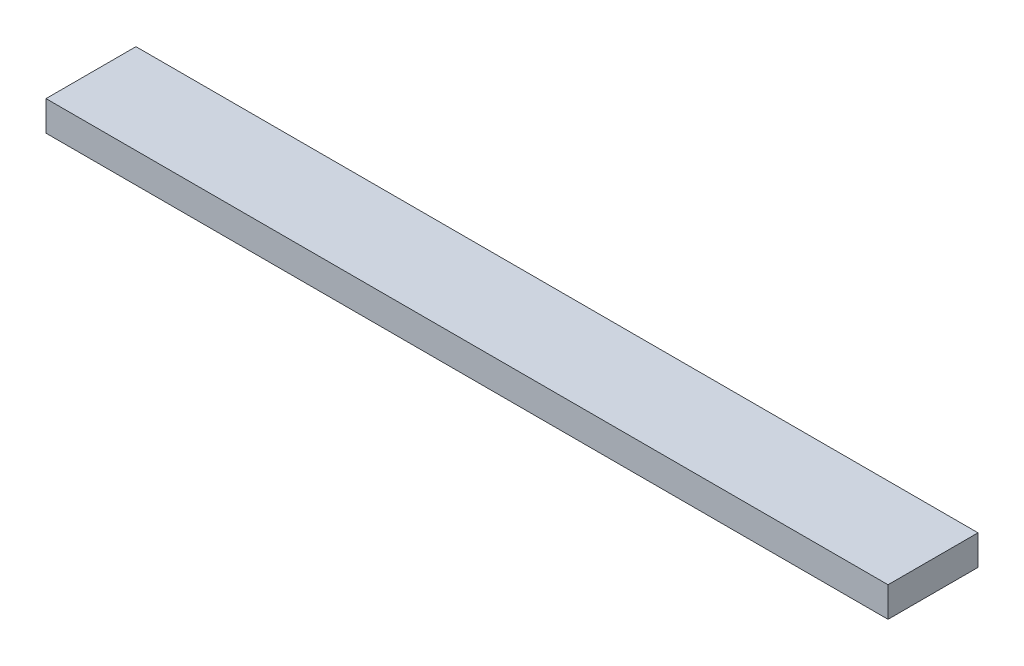
ISO-10303-21;
HEADER;
FILE_DESCRIPTION(('STEP AP214'),'2;1');
FILE_NAME('part.step','',(''),(''),'','','');
FILE_SCHEMA(('AUTOMOTIVE_DESIGN { 1 0 10303 214 1 1 1 1 }'));
ENDSEC;
DATA;
#1=APPLICATION_CONTEXT('core data for automotive mechanical design processes');
#2=APPLICATION_PROTOCOL_DEFINITION('international standard','automotive_design',2000,#1);
#3=PRODUCT_CONTEXT('',#1,'mechanical');
#4=PRODUCT('Part','Part','',(#3));
#5=PRODUCT_RELATED_PRODUCT_CATEGORY('part','',(#4));
#6=PRODUCT_DEFINITION_FORMATION('','',#4);
#7=PRODUCT_DEFINITION_CONTEXT('part definition',#1,'design');
#8=PRODUCT_DEFINITION('design','',#6,#7);
#9=PRODUCT_DEFINITION_SHAPE('','',#8);
#10=(LENGTH_UNIT() NAMED_UNIT(*) SI_UNIT(.MILLI.,.METRE.));
#11=(NAMED_UNIT(*) PLANE_ANGLE_UNIT() SI_UNIT($,.RADIAN.));
#12=(NAMED_UNIT(*) SI_UNIT($,.STERADIAN.) SOLID_ANGLE_UNIT());
#13=UNCERTAINTY_MEASURE_WITH_UNIT(LENGTH_MEASURE(1.E-05),#10,'distance_accuracy_value','');
#14=(GEOMETRIC_REPRESENTATION_CONTEXT(3) GLOBAL_UNCERTAINTY_ASSIGNED_CONTEXT((#13)) GLOBAL_UNIT_ASSIGNED_CONTEXT((#10,
#11,#12)) REPRESENTATION_CONTEXT('',''));
#15=CARTESIAN_POINT('',(0.,0.,0.));
#16=DIRECTION('',(0.,0.,1.));
#17=DIRECTION('',(1.,0.,0.));
#18=AXIS2_PLACEMENT_3D('',#15,#16,#17);
#19=CARTESIAN_POINT('',(0.,100.,0.));
#20=DIRECTION('',(1.,0.,0.));
#21=DIRECTION('',(0.,0.,-1.));
#22=AXIS2_PLACEMENT_3D('',#19,#20,#21);
#23=PLANE('',#22);
#24=DIRECTION('',(0.,0.,1.));
#25=VECTOR('',#24,1.);
#26=CARTESIAN_POINT('',(0.,0.,0.));
#27=LINE('',#26,#25);
#28=CARTESIAN_POINT('',(0.,0.,-300.));
#29=VERTEX_POINT('',#28);
#30=CARTESIAN_POINT('',(0.,0.,0.));
#31=VERTEX_POINT('',#30);
#32=EDGE_CURVE('E111',#29,#31,#27,.T.);
#33=ORIENTED_EDGE('',*,*,#32,.T.);
#34=DIRECTION('',(0.,-1.,0.));
#35=VECTOR('',#34,1.);
#36=CARTESIAN_POINT('',(0.,100.,0.));
#37=LINE('',#36,#35);
#38=CARTESIAN_POINT('',(0.,100.,0.));
#39=VERTEX_POINT('',#38);
#40=EDGE_CURVE('E11',#39,#31,#37,.T.);
#41=ORIENTED_EDGE('',*,*,#40,.F.);
#42=DIRECTION('',(0.,0.,1.));
#43=VECTOR('',#42,1.);
#44=CARTESIAN_POINT('',(0.,100.,0.));
#45=LINE('',#44,#43);
#46=CARTESIAN_POINT('',(0.,100.,-300.));
#47=VERTEX_POINT('',#46);
#48=EDGE_CURVE('E95',#47,#39,#45,.T.);
#49=ORIENTED_EDGE('',*,*,#48,.F.);
#50=DIRECTION('',(0.,-1.,0.));
#51=VECTOR('',#50,1.);
#52=CARTESIAN_POINT('',(0.,100.,-300.));
#53=LINE('',#52,#51);
#54=EDGE_CURVE('E107',#47,#29,#53,.T.);
#55=ORIENTED_EDGE('',*,*,#54,.T.);
#56=EDGE_LOOP('',(#33,#41,#49,#55));
#57=FACE_BOUND('',#56,.T.);
#58=ADVANCED_FACE('F43',(#57),#23,.F.);
#59=CARTESIAN_POINT('',(0.,100.,0.));
#60=DIRECTION('',(0.,0.,-1.));
#61=DIRECTION('',(-1.,0.,0.));
#62=AXIS2_PLACEMENT_3D('',#59,#60,#61);
#63=PLANE('',#62);
#64=DIRECTION('',(1.,0.,0.));
#65=VECTOR('',#64,1.);
#66=CARTESIAN_POINT('',(0.,0.,0.));
#67=LINE('',#66,#65);
#68=CARTESIAN_POINT('',(2808.,0.,0.));
#69=VERTEX_POINT('',#68);
#70=EDGE_CURVE('E100',#31,#69,#67,.T.);
#71=ORIENTED_EDGE('',*,*,#70,.T.);
#72=DIRECTION('',(0.,-1.,0.));
#73=VECTOR('',#72,1.);
#74=CARTESIAN_POINT('',(2808.,100.,0.));
#75=LINE('',#74,#73);
#76=CARTESIAN_POINT('',(2808.,100.,0.));
#77=VERTEX_POINT('',#76);
#78=EDGE_CURVE('E52',#77,#69,#75,.T.);
#79=ORIENTED_EDGE('',*,*,#78,.F.);
#80=DIRECTION('',(1.,0.,0.));
#81=VECTOR('',#80,1.);
#82=CARTESIAN_POINT('',(0.,100.,0.));
#83=LINE('',#82,#81);
#84=EDGE_CURVE('E90',#39,#77,#83,.T.);
#85=ORIENTED_EDGE('',*,*,#84,.F.);
#86=ORIENTED_EDGE('',*,*,#40,.T.);
#87=EDGE_LOOP('',(#71,#79,#85,#86));
#88=FACE_BOUND('',#87,.T.);
#89=ADVANCED_FACE('F99',(#88),#63,.F.);
#90=CARTESIAN_POINT('',(2808.,100.,0.));
#91=DIRECTION('',(-1.,0.,0.));
#92=DIRECTION('',(0.,0.,1.));
#93=AXIS2_PLACEMENT_3D('',#90,#91,#92);
#94=PLANE('',#93);
#95=DIRECTION('',(0.,0.,-1.));
#96=VECTOR('',#95,1.);
#97=CARTESIAN_POINT('',(2808.,0.,0.));
#98=LINE('',#97,#96);
#99=CARTESIAN_POINT('',(2808.,0.,-300.));
#100=VERTEX_POINT('',#99);
#101=EDGE_CURVE('E77',#69,#100,#98,.T.);
#102=ORIENTED_EDGE('',*,*,#101,.T.);
#103=DIRECTION('',(0.,-1.,0.));
#104=VECTOR('',#103,1.);
#105=CARTESIAN_POINT('',(2808.,100.,-300.));
#106=LINE('',#105,#104);
#107=CARTESIAN_POINT('',(2808.,100.,-300.));
#108=VERTEX_POINT('',#107);
#109=EDGE_CURVE('E102',#108,#100,#106,.T.);
#110=ORIENTED_EDGE('',*,*,#109,.F.);
#111=DIRECTION('',(0.,0.,-1.));
#112=VECTOR('',#111,1.);
#113=CARTESIAN_POINT('',(2808.,100.,0.));
#114=LINE('',#113,#112);
#115=EDGE_CURVE('E93',#77,#108,#114,.T.);
#116=ORIENTED_EDGE('',*,*,#115,.F.);
#117=ORIENTED_EDGE('',*,*,#78,.T.);
#118=EDGE_LOOP('',(#102,#110,#116,#117));
#119=FACE_BOUND('',#118,.T.);
#120=ADVANCED_FACE('F103',(#119),#94,.F.);
#121=CARTESIAN_POINT('',(0.,100.,-300.));
#122=DIRECTION('',(0.,0.,1.));
#123=DIRECTION('',(1.,0.,0.));
#124=AXIS2_PLACEMENT_3D('',#121,#122,#123);
#125=PLANE('',#124);
#126=DIRECTION('',(-1.,0.,0.));
#127=VECTOR('',#126,1.);
#128=CARTESIAN_POINT('',(0.,0.,-300.));
#129=LINE('',#128,#127);
#130=EDGE_CURVE('E83',#100,#29,#129,.T.);
#131=ORIENTED_EDGE('',*,*,#130,.T.);
#132=ORIENTED_EDGE('',*,*,#54,.F.);
#133=DIRECTION('',(-1.,0.,0.));
#134=VECTOR('',#133,1.);
#135=CARTESIAN_POINT('',(0.,100.,-300.));
#136=LINE('',#135,#134);
#137=EDGE_CURVE('E60',#108,#47,#136,.T.);
#138=ORIENTED_EDGE('',*,*,#137,.F.);
#139=ORIENTED_EDGE('',*,*,#109,.T.);
#140=EDGE_LOOP('',(#131,#132,#138,#139));
#141=FACE_BOUND('',#140,.T.);
#142=ADVANCED_FACE('F124',(#141),#125,.F.);
#143=CARTESIAN_POINT('',(0.,100.,0.));
#144=DIRECTION('',(0.,-1.,0.));
#145=DIRECTION('',(0.,0.,-1.));
#146=AXIS2_PLACEMENT_3D('',#143,#144,#145);
#147=PLANE('',#146);
#148=ORIENTED_EDGE('',*,*,#48,.T.);
#149=ORIENTED_EDGE('',*,*,#84,.T.);
#150=ORIENTED_EDGE('',*,*,#115,.T.);
#151=ORIENTED_EDGE('',*,*,#137,.T.);
#152=EDGE_LOOP('',(#148,#149,#150,#151));
#153=FACE_BOUND('',#152,.T.);
#154=ADVANCED_FACE('F91',(#153),#147,.F.);
#155=CARTESIAN_POINT('',(0.,0.,0.));
#156=DIRECTION('',(0.,-1.,0.));
#157=DIRECTION('',(0.,0.,-1.));
#158=AXIS2_PLACEMENT_3D('',#155,#156,#157);
#159=PLANE('',#158);
#160=ORIENTED_EDGE('',*,*,#32,.F.);
#161=ORIENTED_EDGE('',*,*,#130,.F.);
#162=ORIENTED_EDGE('',*,*,#101,.F.);
#163=ORIENTED_EDGE('',*,*,#70,.F.);
#164=EDGE_LOOP('',(#160,#161,#162,#163));
#165=FACE_BOUND('',#164,.T.);
#166=ADVANCED_FACE('F127',(#165),#159,.T.);
#167=CLOSED_SHELL('',(#58,#89,#120,#142,#154,#166));
#168=MANIFOLD_SOLID_BREP('B2',#167);
#169=ADVANCED_BREP_SHAPE_REPRESENTATION('',(#18,#168),#14);
#170=SHAPE_DEFINITION_REPRESENTATION(#9,#169);
ENDSEC;
END-ISO-10303-21;
